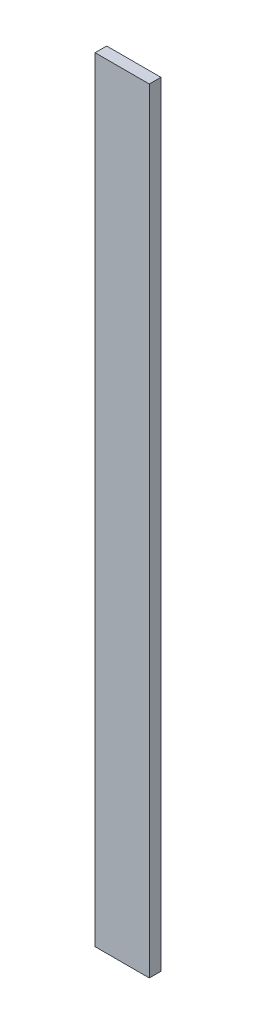
ISO-10303-21;
HEADER;
FILE_DESCRIPTION(('STEP AP214'),'2;1');
FILE_NAME('part.step','',(''),(''),'','','');
FILE_SCHEMA(('AUTOMOTIVE_DESIGN { 1 0 10303 214 1 1 1 1 }'));
ENDSEC;
DATA;
#1=APPLICATION_CONTEXT('core data for automotive mechanical design processes');
#2=APPLICATION_PROTOCOL_DEFINITION('international standard','automotive_design',2000,#1);
#3=PRODUCT_CONTEXT('',#1,'mechanical');
#4=PRODUCT('Part','Part','',(#3));
#5=PRODUCT_RELATED_PRODUCT_CATEGORY('part','',(#4));
#6=PRODUCT_DEFINITION_FORMATION('','',#4);
#7=PRODUCT_DEFINITION_CONTEXT('part definition',#1,'design');
#8=PRODUCT_DEFINITION('design','',#6,#7);
#9=PRODUCT_DEFINITION_SHAPE('','',#8);
#10=(LENGTH_UNIT() NAMED_UNIT(*) SI_UNIT(.MILLI.,.METRE.));
#11=(NAMED_UNIT(*) PLANE_ANGLE_UNIT() SI_UNIT($,.RADIAN.));
#12=(NAMED_UNIT(*) SI_UNIT($,.STERADIAN.) SOLID_ANGLE_UNIT());
#13=UNCERTAINTY_MEASURE_WITH_UNIT(LENGTH_MEASURE(1.E-05),#10,'distance_accuracy_value','');
#14=(GEOMETRIC_REPRESENTATION_CONTEXT(3) GLOBAL_UNCERTAINTY_ASSIGNED_CONTEXT((#13)) GLOBAL_UNIT_ASSIGNED_CONTEXT((#10,
#11,#12)) REPRESENTATION_CONTEXT('',''));
#15=CARTESIAN_POINT('',(0.,0.,0.));
#16=DIRECTION('',(0.,0.,1.));
#17=DIRECTION('',(1.,0.,0.));
#18=AXIS2_PLACEMENT_3D('',#15,#16,#17);
#19=CARTESIAN_POINT('',(0.,0.,15.));
#20=DIRECTION('',(0.,-1.,0.));
#21=DIRECTION('',(0.,0.,-1.));
#22=AXIS2_PLACEMENT_3D('',#19,#20,#21);
#23=PLANE('',#22);
#24=DIRECTION('',(-1.,0.,0.));
#25=VECTOR('',#24,1.);
#26=CARTESIAN_POINT('',(0.,0.,0.));
#27=LINE('',#26,#25);
#28=CARTESIAN_POINT('',(0.,0.,0.));
#29=VERTEX_POINT('',#28);
#30=CARTESIAN_POINT('',(-70.,0.,0.));
#31=VERTEX_POINT('',#30);
#32=EDGE_CURVE('E96',#29,#31,#27,.T.);
#33=ORIENTED_EDGE('',*,*,#32,.T.);
#34=DIRECTION('',(0.,0.,-1.));
#35=VECTOR('',#34,1.);
#36=CARTESIAN_POINT('',(-70.,0.,15.));
#37=LINE('',#36,#35);
#38=CARTESIAN_POINT('',(-70.,0.,15.));
#39=VERTEX_POINT('',#38);
#40=EDGE_CURVE('E11',#39,#31,#37,.T.);
#41=ORIENTED_EDGE('',*,*,#40,.F.);
#42=DIRECTION('',(-1.,0.,0.));
#43=VECTOR('',#42,1.);
#44=CARTESIAN_POINT('',(0.,0.,15.));
#45=LINE('',#44,#43);
#46=CARTESIAN_POINT('',(0.,0.,15.));
#47=VERTEX_POINT('',#46);
#48=EDGE_CURVE('E82',#47,#39,#45,.T.);
#49=ORIENTED_EDGE('',*,*,#48,.F.);
#50=DIRECTION('',(0.,0.,-1.));
#51=VECTOR('',#50,1.);
#52=CARTESIAN_POINT('',(0.,0.,15.));
#53=LINE('',#52,#51);
#54=EDGE_CURVE('E49',#47,#29,#53,.T.);
#55=ORIENTED_EDGE('',*,*,#54,.T.);
#56=EDGE_LOOP('',(#33,#41,#49,#55));
#57=FACE_BOUND('',#56,.T.);
#58=ADVANCED_FACE('F33',(#57),#23,.F.);
#59=CARTESIAN_POINT('',(-70.,0.,15.));
#60=DIRECTION('',(1.,0.,0.));
#61=DIRECTION('',(0.,1.,0.));
#62=AXIS2_PLACEMENT_3D('',#59,#60,#61);
#63=PLANE('',#62);
#64=DIRECTION('',(0.,-1.,0.));
#65=VECTOR('',#64,1.);
#66=CARTESIAN_POINT('',(-70.,0.,0.));
#67=LINE('',#66,#65);
#68=CARTESIAN_POINT('',(-69.9999999999999,-1000.,0.));
#69=VERTEX_POINT('',#68);
#70=EDGE_CURVE('E87',#31,#69,#67,.T.);
#71=ORIENTED_EDGE('',*,*,#70,.T.);
#72=DIRECTION('',(0.,0.,-1.));
#73=VECTOR('',#72,1.);
#74=CARTESIAN_POINT('',(-69.9999999999999,-1000.,15.));
#75=LINE('',#74,#73);
#76=CARTESIAN_POINT('',(-69.9999999999999,-1000.,15.));
#77=VERTEX_POINT('',#76);
#78=EDGE_CURVE('E41',#77,#69,#75,.T.);
#79=ORIENTED_EDGE('',*,*,#78,.F.);
#80=DIRECTION('',(0.,-1.,0.));
#81=VECTOR('',#80,1.);
#82=CARTESIAN_POINT('',(-70.,0.,15.));
#83=LINE('',#82,#81);
#84=EDGE_CURVE('E74',#39,#77,#83,.T.);
#85=ORIENTED_EDGE('',*,*,#84,.F.);
#86=ORIENTED_EDGE('',*,*,#40,.T.);
#87=EDGE_LOOP('',(#71,#79,#85,#86));
#88=FACE_BOUND('',#87,.T.);
#89=ADVANCED_FACE('F86',(#88),#63,.F.);
#90=CARTESIAN_POINT('',(1.22464679914735E-13,-1000.,15.));
#91=DIRECTION('',(0.,-1.,0.));
#92=DIRECTION('',(0.,0.,-1.));
#93=AXIS2_PLACEMENT_3D('',#90,#91,#92);
#94=PLANE('',#93);
#95=DIRECTION('',(-1.,0.,0.));
#96=VECTOR('',#95,1.);
#97=CARTESIAN_POINT('',(1.22464679914735E-13,-1000.,0.));
#98=LINE('',#97,#96);
#99=CARTESIAN_POINT('',(1.22464679914735E-13,-1000.,0.));
#100=VERTEX_POINT('',#99);
#101=EDGE_CURVE('E100',#100,#69,#98,.T.);
#102=ORIENTED_EDGE('',*,*,#101,.F.);
#103=DIRECTION('',(0.,0.,-1.));
#104=VECTOR('',#103,1.);
#105=CARTESIAN_POINT('',(1.22464679914735E-13,-1000.,15.));
#106=LINE('',#105,#104);
#107=CARTESIAN_POINT('',(1.22464679914735E-13,-1000.,15.));
#108=VERTEX_POINT('',#107);
#109=EDGE_CURVE('E63',#108,#100,#106,.T.);
#110=ORIENTED_EDGE('',*,*,#109,.F.);
#111=DIRECTION('',(-1.,0.,0.));
#112=VECTOR('',#111,1.);
#113=CARTESIAN_POINT('',(1.22464679914735E-13,-1000.,15.));
#114=LINE('',#113,#112);
#115=EDGE_CURVE('E81',#108,#77,#114,.T.);
#116=ORIENTED_EDGE('',*,*,#115,.T.);
#117=ORIENTED_EDGE('',*,*,#78,.T.);
#118=EDGE_LOOP('',(#102,#110,#116,#117));
#119=FACE_BOUND('',#118,.T.);
#120=ADVANCED_FACE('F90',(#119),#94,.T.);
#121=CARTESIAN_POINT('',(0.,0.,15.));
#122=DIRECTION('',(1.,0.,0.));
#123=DIRECTION('',(0.,1.,0.));
#124=AXIS2_PLACEMENT_3D('',#121,#122,#123);
#125=PLANE('',#124);
#126=DIRECTION('',(0.,-1.,0.));
#127=VECTOR('',#126,1.);
#128=CARTESIAN_POINT('',(0.,0.,0.));
#129=LINE('',#128,#127);
#130=EDGE_CURVE('E102',#29,#100,#129,.T.);
#131=ORIENTED_EDGE('',*,*,#130,.F.);
#132=ORIENTED_EDGE('',*,*,#54,.F.);
#133=DIRECTION('',(0.,-1.,0.));
#134=VECTOR('',#133,1.);
#135=CARTESIAN_POINT('',(0.,0.,15.));
#136=LINE('',#135,#134);
#137=EDGE_CURVE('E91',#47,#108,#136,.T.);
#138=ORIENTED_EDGE('',*,*,#137,.T.);
#139=ORIENTED_EDGE('',*,*,#109,.T.);
#140=EDGE_LOOP('',(#131,#132,#138,#139));
#141=FACE_BOUND('',#140,.T.);
#142=ADVANCED_FACE('F175',(#141),#125,.T.);
#143=CARTESIAN_POINT('',(0.,0.,15.));
#144=DIRECTION('',(0.,0.,1.));
#145=DIRECTION('',(1.,0.,0.));
#146=AXIS2_PLACEMENT_3D('',#143,#144,#145);
#147=PLANE('',#146);
#148=ORIENTED_EDGE('',*,*,#48,.T.);
#149=ORIENTED_EDGE('',*,*,#84,.T.);
#150=ORIENTED_EDGE('',*,*,#115,.F.);
#151=ORIENTED_EDGE('',*,*,#137,.F.);
#152=EDGE_LOOP('',(#148,#149,#150,#151));
#153=FACE_BOUND('',#152,.T.);
#154=ADVANCED_FACE('F78',(#153),#147,.T.);
#155=CARTESIAN_POINT('',(0.,0.,0.));
#156=DIRECTION('',(0.,0.,1.));
#157=DIRECTION('',(1.,0.,0.));
#158=AXIS2_PLACEMENT_3D('',#155,#156,#157);
#159=PLANE('',#158);
#160=CARTESIAN_POINT('',(-35.,-30.,0.));
#161=DIRECTION('',(0.,0.,-1.));
#162=DIRECTION('',(-1.,0.,0.));
#163=AXIS2_PLACEMENT_3D('',#160,#161,#162);
#164=CIRCLE('',#163,10.);
#165=CARTESIAN_POINT('',(-45.,-30.,0.));
#166=VERTEX_POINT('',#165);
#167=EDGE_CURVE('E144',#166,#166,#164,.T.);
#168=ORIENTED_EDGE('',*,*,#167,.F.);
#169=EDGE_LOOP('',(#168));
#170=FACE_BOUND('',#169,.T.);
#171=CARTESIAN_POINT('',(-35.0000000000016,-180.,0.));
#172=DIRECTION('',(0.,0.,-1.));
#173=DIRECTION('',(-1.,0.,0.));
#174=AXIS2_PLACEMENT_3D('',#171,#172,#173);
#175=CIRCLE('',#174,10.);
#176=CARTESIAN_POINT('',(-45.0000000000016,-180.,0.));
#177=VERTEX_POINT('',#176);
#178=EDGE_CURVE('E141',#177,#177,#175,.T.);
#179=ORIENTED_EDGE('',*,*,#178,.F.);
#180=EDGE_LOOP('',(#179));
#181=FACE_BOUND('',#180,.T.);
#182=CARTESIAN_POINT('',(-35.0000000000031,-330.,0.));
#183=DIRECTION('',(0.,0.,-1.));
#184=DIRECTION('',(-1.,0.,0.));
#185=AXIS2_PLACEMENT_3D('',#182,#183,#184);
#186=CIRCLE('',#185,9.99999999999999);
#187=CARTESIAN_POINT('',(-45.0000000000031,-330.,0.));
#188=VERTEX_POINT('',#187);
#189=EDGE_CURVE('E135',#188,#188,#186,.T.);
#190=ORIENTED_EDGE('',*,*,#189,.F.);
#191=EDGE_LOOP('',(#190));
#192=FACE_BOUND('',#191,.T.);
#193=CARTESIAN_POINT('',(-35.0000000000047,-480.,0.));
#194=DIRECTION('',(0.,0.,-1.));
#195=DIRECTION('',(-1.,0.,0.));
#196=AXIS2_PLACEMENT_3D('',#193,#194,#195);
#197=CIRCLE('',#196,10.);
#198=CARTESIAN_POINT('',(-45.0000000000047,-480.,0.));
#199=VERTEX_POINT('',#198);
#200=EDGE_CURVE('E129',#199,#199,#197,.T.);
#201=ORIENTED_EDGE('',*,*,#200,.F.);
#202=EDGE_LOOP('',(#201));
#203=FACE_BOUND('',#202,.T.);
#204=CARTESIAN_POINT('',(-35.0000000000063,-630.,0.));
#205=DIRECTION('',(0.,0.,-1.));
#206=DIRECTION('',(-1.,0.,0.));
#207=AXIS2_PLACEMENT_3D('',#204,#205,#206);
#208=CIRCLE('',#207,10.);
#209=CARTESIAN_POINT('',(-45.0000000000063,-630.,0.));
#210=VERTEX_POINT('',#209);
#211=EDGE_CURVE('E123',#210,#210,#208,.T.);
#212=ORIENTED_EDGE('',*,*,#211,.F.);
#213=EDGE_LOOP('',(#212));
#214=FACE_BOUND('',#213,.T.);
#215=CARTESIAN_POINT('',(-35.0000000000079,-780.,0.));
#216=DIRECTION('',(0.,0.,-1.));
#217=DIRECTION('',(-1.,0.,0.));
#218=AXIS2_PLACEMENT_3D('',#215,#216,#217);
#219=CIRCLE('',#218,10.);
#220=CARTESIAN_POINT('',(-45.0000000000079,-780.,0.));
#221=VERTEX_POINT('',#220);
#222=EDGE_CURVE('E117',#221,#221,#219,.T.);
#223=ORIENTED_EDGE('',*,*,#222,.F.);
#224=EDGE_LOOP('',(#223));
#225=FACE_BOUND('',#224,.T.);
#226=CARTESIAN_POINT('',(-35.0000000000094,-930.,0.));
#227=DIRECTION('',(0.,0.,-1.));
#228=DIRECTION('',(-1.,0.,0.));
#229=AXIS2_PLACEMENT_3D('',#226,#227,#228);
#230=CIRCLE('',#229,10.);
#231=CARTESIAN_POINT('',(-45.0000000000094,-930.,0.));
#232=VERTEX_POINT('',#231);
#233=EDGE_CURVE('E111',#232,#232,#230,.T.);
#234=ORIENTED_EDGE('',*,*,#233,.F.);
#235=EDGE_LOOP('',(#234));
#236=FACE_BOUND('',#235,.T.);
#237=ORIENTED_EDGE('',*,*,#32,.F.);
#238=ORIENTED_EDGE('',*,*,#130,.T.);
#239=ORIENTED_EDGE('',*,*,#101,.T.);
#240=ORIENTED_EDGE('',*,*,#70,.F.);
#241=EDGE_LOOP('',(#237,#238,#239,#240));
#242=FACE_BOUND('',#241,.T.);
#243=ADVANCED_FACE('F159',(#170,#181,#192,#203,#214,#225,#236,#242),#159,.F.);
#244=CARTESIAN_POINT('',(-35.0000000000094,-930.,8.));
#245=DIRECTION('',(0.,0.,-1.));
#246=DIRECTION('',(-1.,0.,0.));
#247=AXIS2_PLACEMENT_3D('',#244,#245,#246);
#248=CYLINDRICAL_SURFACE('',#247,10.);
#249=CARTESIAN_POINT('',(-35.0000000000094,-930.,8.));
#250=DIRECTION('',(0.,0.,-1.));
#251=DIRECTION('',(-1.,0.,0.));
#252=AXIS2_PLACEMENT_3D('',#249,#250,#251);
#253=CIRCLE('',#252,10.);
#254=CARTESIAN_POINT('',(-45.0000000000094,-930.,8.));
#255=VERTEX_POINT('',#254);
#256=EDGE_CURVE('E108',#255,#255,#253,.T.);
#257=ORIENTED_EDGE('',*,*,#256,.F.);
#258=EDGE_LOOP('',(#257));
#259=FACE_BOUND('',#258,.T.);
#260=ORIENTED_EDGE('',*,*,#233,.T.);
#261=EDGE_LOOP('',(#260));
#262=FACE_BOUND('',#261,.T.);
#263=ADVANCED_FACE('F162',(#259,#262),#248,.F.);
#264=CARTESIAN_POINT('',(-35.0000000000094,-930.,8.));
#265=DIRECTION('',(0.,0.,-1.));
#266=DIRECTION('',(-1.,0.,0.));
#267=AXIS2_PLACEMENT_3D('',#264,#265,#266);
#268=PLANE('',#267);
#269=ORIENTED_EDGE('',*,*,#256,.T.);
#270=EDGE_LOOP('',(#269));
#271=FACE_BOUND('',#270,.T.);
#272=ADVANCED_FACE('F219',(#271),#268,.T.);
#273=CARTESIAN_POINT('',(-35.0000000000079,-780.,8.));
#274=DIRECTION('',(0.,0.,-1.));
#275=DIRECTION('',(-1.,0.,0.));
#276=AXIS2_PLACEMENT_3D('',#273,#274,#275);
#277=CYLINDRICAL_SURFACE('',#276,10.);
#278=CARTESIAN_POINT('',(-35.0000000000079,-780.,8.));
#279=DIRECTION('',(0.,0.,-1.));
#280=DIRECTION('',(-1.,0.,0.));
#281=AXIS2_PLACEMENT_3D('',#278,#279,#280);
#282=CIRCLE('',#281,10.);
#283=CARTESIAN_POINT('',(-45.0000000000079,-780.,8.));
#284=VERTEX_POINT('',#283);
#285=EDGE_CURVE('E114',#284,#284,#282,.T.);
#286=ORIENTED_EDGE('',*,*,#285,.F.);
#287=EDGE_LOOP('',(#286));
#288=FACE_BOUND('',#287,.T.);
#289=ORIENTED_EDGE('',*,*,#222,.T.);
#290=EDGE_LOOP('',(#289));
#291=FACE_BOUND('',#290,.T.);
#292=ADVANCED_FACE('F229',(#288,#291),#277,.F.);
#293=CARTESIAN_POINT('',(-35.0000000000079,-780.,8.));
#294=DIRECTION('',(0.,0.,-1.));
#295=DIRECTION('',(-1.,0.,0.));
#296=AXIS2_PLACEMENT_3D('',#293,#294,#295);
#297=PLANE('',#296);
#298=ORIENTED_EDGE('',*,*,#285,.T.);
#299=EDGE_LOOP('',(#298));
#300=FACE_BOUND('',#299,.T.);
#301=ADVANCED_FACE('F239',(#300),#297,.T.);
#302=CARTESIAN_POINT('',(-35.0000000000063,-630.,8.));
#303=DIRECTION('',(0.,0.,-1.));
#304=DIRECTION('',(-1.,0.,0.));
#305=AXIS2_PLACEMENT_3D('',#302,#303,#304);
#306=CYLINDRICAL_SURFACE('',#305,10.);
#307=CARTESIAN_POINT('',(-35.0000000000063,-630.,8.));
#308=DIRECTION('',(0.,0.,-1.));
#309=DIRECTION('',(-1.,0.,0.));
#310=AXIS2_PLACEMENT_3D('',#307,#308,#309);
#311=CIRCLE('',#310,10.);
#312=CARTESIAN_POINT('',(-45.0000000000063,-630.,8.));
#313=VERTEX_POINT('',#312);
#314=EDGE_CURVE('E120',#313,#313,#311,.T.);
#315=ORIENTED_EDGE('',*,*,#314,.F.);
#316=EDGE_LOOP('',(#315));
#317=FACE_BOUND('',#316,.T.);
#318=ORIENTED_EDGE('',*,*,#211,.T.);
#319=EDGE_LOOP('',(#318));
#320=FACE_BOUND('',#319,.T.);
#321=ADVANCED_FACE('F249',(#317,#320),#306,.F.);
#322=CARTESIAN_POINT('',(-35.0000000000063,-630.,8.));
#323=DIRECTION('',(0.,0.,-1.));
#324=DIRECTION('',(-1.,0.,0.));
#325=AXIS2_PLACEMENT_3D('',#322,#323,#324);
#326=PLANE('',#325);
#327=ORIENTED_EDGE('',*,*,#314,.T.);
#328=EDGE_LOOP('',(#327));
#329=FACE_BOUND('',#328,.T.);
#330=ADVANCED_FACE('F259',(#329),#326,.T.);
#331=CARTESIAN_POINT('',(-35.0000000000047,-480.,8.));
#332=DIRECTION('',(0.,0.,-1.));
#333=DIRECTION('',(-1.,0.,0.));
#334=AXIS2_PLACEMENT_3D('',#331,#332,#333);
#335=CYLINDRICAL_SURFACE('',#334,10.);
#336=CARTESIAN_POINT('',(-35.0000000000047,-480.,8.));
#337=DIRECTION('',(0.,0.,-1.));
#338=DIRECTION('',(-1.,0.,0.));
#339=AXIS2_PLACEMENT_3D('',#336,#337,#338);
#340=CIRCLE('',#339,10.);
#341=CARTESIAN_POINT('',(-45.0000000000047,-480.,8.));
#342=VERTEX_POINT('',#341);
#343=EDGE_CURVE('E126',#342,#342,#340,.T.);
#344=ORIENTED_EDGE('',*,*,#343,.F.);
#345=EDGE_LOOP('',(#344));
#346=FACE_BOUND('',#345,.T.);
#347=ORIENTED_EDGE('',*,*,#200,.T.);
#348=EDGE_LOOP('',(#347));
#349=FACE_BOUND('',#348,.T.);
#350=ADVANCED_FACE('F269',(#346,#349),#335,.F.);
#351=CARTESIAN_POINT('',(-35.0000000000047,-480.,8.));
#352=DIRECTION('',(0.,0.,-1.));
#353=DIRECTION('',(-1.,0.,0.));
#354=AXIS2_PLACEMENT_3D('',#351,#352,#353);
#355=PLANE('',#354);
#356=ORIENTED_EDGE('',*,*,#343,.T.);
#357=EDGE_LOOP('',(#356));
#358=FACE_BOUND('',#357,.T.);
#359=ADVANCED_FACE('F279',(#358),#355,.T.);
#360=CARTESIAN_POINT('',(-35.0000000000031,-330.,8.));
#361=DIRECTION('',(0.,0.,-1.));
#362=DIRECTION('',(-1.,0.,0.));
#363=AXIS2_PLACEMENT_3D('',#360,#361,#362);
#364=CYLINDRICAL_SURFACE('',#363,9.99999999999999);
#365=CARTESIAN_POINT('',(-35.0000000000031,-330.,8.));
#366=DIRECTION('',(0.,0.,-1.));
#367=DIRECTION('',(-1.,0.,0.));
#368=AXIS2_PLACEMENT_3D('',#365,#366,#367);
#369=CIRCLE('',#368,9.99999999999999);
#370=CARTESIAN_POINT('',(-45.0000000000031,-330.,8.));
#371=VERTEX_POINT('',#370);
#372=EDGE_CURVE('E132',#371,#371,#369,.T.);
#373=ORIENTED_EDGE('',*,*,#372,.F.);
#374=EDGE_LOOP('',(#373));
#375=FACE_BOUND('',#374,.T.);
#376=ORIENTED_EDGE('',*,*,#189,.T.);
#377=EDGE_LOOP('',(#376));
#378=FACE_BOUND('',#377,.T.);
#379=ADVANCED_FACE('F289',(#375,#378),#364,.F.);
#380=CARTESIAN_POINT('',(-35.0000000000031,-330.,8.));
#381=DIRECTION('',(0.,0.,-1.));
#382=DIRECTION('',(-1.,0.,0.));
#383=AXIS2_PLACEMENT_3D('',#380,#381,#382);
#384=PLANE('',#383);
#385=ORIENTED_EDGE('',*,*,#372,.T.);
#386=EDGE_LOOP('',(#385));
#387=FACE_BOUND('',#386,.T.);
#388=ADVANCED_FACE('F299',(#387),#384,.T.);
#389=CARTESIAN_POINT('',(-35.0000000000016,-180.,8.));
#390=DIRECTION('',(0.,0.,-1.));
#391=DIRECTION('',(-1.,0.,0.));
#392=AXIS2_PLACEMENT_3D('',#389,#390,#391);
#393=CYLINDRICAL_SURFACE('',#392,10.);
#394=CARTESIAN_POINT('',(-35.0000000000016,-180.,8.));
#395=DIRECTION('',(0.,0.,-1.));
#396=DIRECTION('',(-1.,0.,0.));
#397=AXIS2_PLACEMENT_3D('',#394,#395,#396);
#398=CIRCLE('',#397,10.);
#399=CARTESIAN_POINT('',(-45.0000000000016,-180.,8.));
#400=VERTEX_POINT('',#399);
#401=EDGE_CURVE('E138',#400,#400,#398,.T.);
#402=ORIENTED_EDGE('',*,*,#401,.F.);
#403=EDGE_LOOP('',(#402));
#404=FACE_BOUND('',#403,.T.);
#405=ORIENTED_EDGE('',*,*,#178,.T.);
#406=EDGE_LOOP('',(#405));
#407=FACE_BOUND('',#406,.T.);
#408=ADVANCED_FACE('F309',(#404,#407),#393,.F.);
#409=CARTESIAN_POINT('',(-35.0000000000016,-180.,8.));
#410=DIRECTION('',(0.,0.,-1.));
#411=DIRECTION('',(-1.,0.,0.));
#412=AXIS2_PLACEMENT_3D('',#409,#410,#411);
#413=PLANE('',#412);
#414=ORIENTED_EDGE('',*,*,#401,.T.);
#415=EDGE_LOOP('',(#414));
#416=FACE_BOUND('',#415,.T.);
#417=ADVANCED_FACE('F155',(#416),#413,.T.);
#418=CARTESIAN_POINT('',(-35.,-30.,8.));
#419=DIRECTION('',(0.,0.,-1.));
#420=DIRECTION('',(-1.,0.,0.));
#421=AXIS2_PLACEMENT_3D('',#418,#419,#420);
#422=CYLINDRICAL_SURFACE('',#421,10.);
#423=CARTESIAN_POINT('',(-35.,-30.,8.));
#424=DIRECTION('',(0.,0.,-1.));
#425=DIRECTION('',(-1.,0.,0.));
#426=AXIS2_PLACEMENT_3D('',#423,#424,#425);
#427=CIRCLE('',#426,10.);
#428=CARTESIAN_POINT('',(-45.,-30.,8.));
#429=VERTEX_POINT('',#428);
#430=EDGE_CURVE('E98',#429,#429,#427,.T.);
#431=ORIENTED_EDGE('',*,*,#430,.F.);
#432=EDGE_LOOP('',(#431));
#433=FACE_BOUND('',#432,.T.);
#434=ORIENTED_EDGE('',*,*,#167,.T.);
#435=EDGE_LOOP('',(#434));
#436=FACE_BOUND('',#435,.T.);
#437=ADVANCED_FACE('F152',(#433,#436),#422,.F.);
#438=CARTESIAN_POINT('',(-35.,-30.,8.));
#439=DIRECTION('',(0.,0.,-1.));
#440=DIRECTION('',(-1.,0.,0.));
#441=AXIS2_PLACEMENT_3D('',#438,#439,#440);
#442=PLANE('',#441);
#443=ORIENTED_EDGE('',*,*,#430,.T.);
#444=EDGE_LOOP('',(#443));
#445=FACE_BOUND('',#444,.T.);
#446=ADVANCED_FACE('F150',(#445),#442,.T.);
#447=CLOSED_SHELL('',(#58,#89,#120,#142,#154,#243,#263,#272,#292,#301,#321,#330,#350,#359,#379,
#388,#408,#417,#437,#446));
#448=MANIFOLD_SOLID_BREP('B2',#447);
#449=ADVANCED_BREP_SHAPE_REPRESENTATION('',(#18,#448),#14);
#450=SHAPE_DEFINITION_REPRESENTATION(#9,#449);
ENDSEC;
END-ISO-10303-21;
